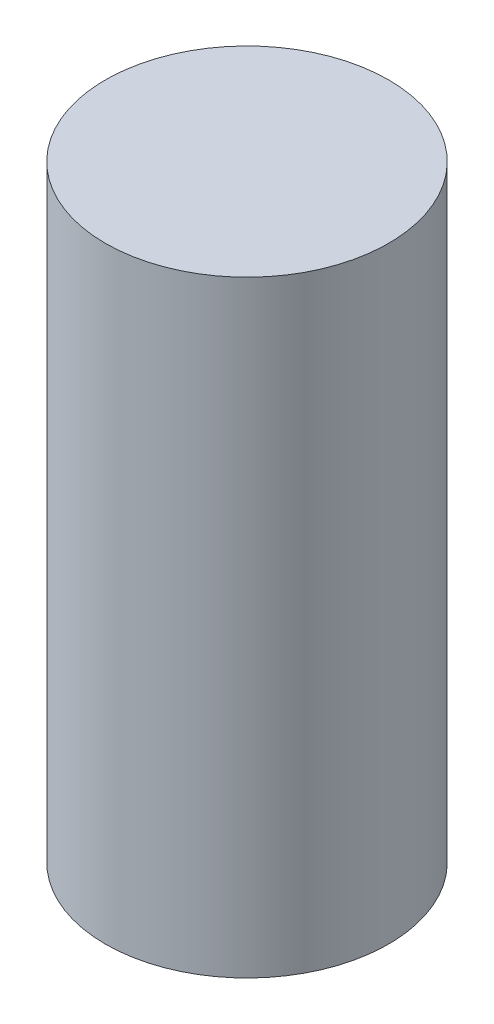
ISO-10303-21;
HEADER;
FILE_DESCRIPTION(('STEP AP214'),'2;1');
FILE_NAME('part.step','',(''),(''),'','','');
FILE_SCHEMA(('AUTOMOTIVE_DESIGN { 1 0 10303 214 1 1 1 1 }'));
ENDSEC;
DATA;
#1=APPLICATION_CONTEXT('core data for automotive mechanical design processes');
#2=APPLICATION_PROTOCOL_DEFINITION('international standard','automotive_design',2000,#1);
#3=PRODUCT_CONTEXT('',#1,'mechanical');
#4=PRODUCT('Part','Part','',(#3));
#5=PRODUCT_RELATED_PRODUCT_CATEGORY('part','',(#4));
#6=PRODUCT_DEFINITION_FORMATION('','',#4);
#7=PRODUCT_DEFINITION_CONTEXT('part definition',#1,'design');
#8=PRODUCT_DEFINITION('design','',#6,#7);
#9=PRODUCT_DEFINITION_SHAPE('','',#8);
#10=(LENGTH_UNIT() NAMED_UNIT(*) SI_UNIT(.MILLI.,.METRE.));
#11=(NAMED_UNIT(*) PLANE_ANGLE_UNIT() SI_UNIT($,.RADIAN.));
#12=(NAMED_UNIT(*) SI_UNIT($,.STERADIAN.) SOLID_ANGLE_UNIT());
#13=UNCERTAINTY_MEASURE_WITH_UNIT(LENGTH_MEASURE(1.E-05),#10,'distance_accuracy_value','');
#14=(GEOMETRIC_REPRESENTATION_CONTEXT(3) GLOBAL_UNCERTAINTY_ASSIGNED_CONTEXT((#13)) GLOBAL_UNIT_ASSIGNED_CONTEXT((#10,
#11,#12)) REPRESENTATION_CONTEXT('',''));
#15=CARTESIAN_POINT('',(0.,0.,0.));
#16=DIRECTION('',(0.,0.,1.));
#17=DIRECTION('',(1.,0.,0.));
#18=AXIS2_PLACEMENT_3D('',#15,#16,#17);
#19=CARTESIAN_POINT('',(0.,300.,0.));
#20=DIRECTION('',(0.,-1.,0.));
#21=DIRECTION('',(0.,0.,-1.));
#22=AXIS2_PLACEMENT_3D('',#19,#20,#21);
#23=CYLINDRICAL_SURFACE('',#22,70.);
#24=CARTESIAN_POINT('',(0.,300.,0.));
#25=DIRECTION('',(0.,1.,0.));
#26=DIRECTION('',(0.,0.,1.));
#27=AXIS2_PLACEMENT_3D('',#24,#25,#26);
#28=CIRCLE('',#27,70.);
#29=CARTESIAN_POINT('',(0.,300.,70.));
#30=VERTEX_POINT('',#29);
#31=EDGE_CURVE('E10',#30,#30,#28,.T.);
#32=ORIENTED_EDGE('',*,*,#31,.F.);
#33=EDGE_LOOP('',(#32));
#34=FACE_BOUND('',#33,.T.);
#35=CARTESIAN_POINT('',(0.,0.,0.));
#36=DIRECTION('',(0.,1.,0.));
#37=DIRECTION('',(0.,0.,1.));
#38=AXIS2_PLACEMENT_3D('',#35,#36,#37);
#39=CIRCLE('',#38,70.);
#40=CARTESIAN_POINT('',(0.,0.,70.));
#41=VERTEX_POINT('',#40);
#42=EDGE_CURVE('E34',#41,#41,#39,.T.);
#43=ORIENTED_EDGE('',*,*,#42,.T.);
#44=EDGE_LOOP('',(#43));
#45=FACE_BOUND('',#44,.T.);
#46=ADVANCED_FACE('F31',(#34,#45),#23,.T.);
#47=CARTESIAN_POINT('',(0.,300.,0.));
#48=DIRECTION('',(0.,1.,0.));
#49=DIRECTION('',(0.,0.,1.));
#50=AXIS2_PLACEMENT_3D('',#47,#48,#49);
#51=PLANE('',#50);
#52=ORIENTED_EDGE('',*,*,#31,.T.);
#53=EDGE_LOOP('',(#52));
#54=FACE_BOUND('',#53,.T.);
#55=ADVANCED_FACE('F46',(#54),#51,.T.);
#56=CARTESIAN_POINT('',(0.,0.,0.));
#57=DIRECTION('',(0.,1.,0.));
#58=DIRECTION('',(0.,0.,1.));
#59=AXIS2_PLACEMENT_3D('',#56,#57,#58);
#60=PLANE('',#59);
#61=ORIENTED_EDGE('',*,*,#42,.F.);
#62=EDGE_LOOP('',(#61));
#63=FACE_BOUND('',#62,.T.);
#64=ADVANCED_FACE('F44',(#63),#60,.F.);
#65=CLOSED_SHELL('',(#46,#55,#64));
#66=MANIFOLD_SOLID_BREP('B2',#65);
#67=ADVANCED_BREP_SHAPE_REPRESENTATION('',(#18,#66),#14);
#68=SHAPE_DEFINITION_REPRESENTATION(#9,#67);
ENDSEC;
END-ISO-10303-21;
